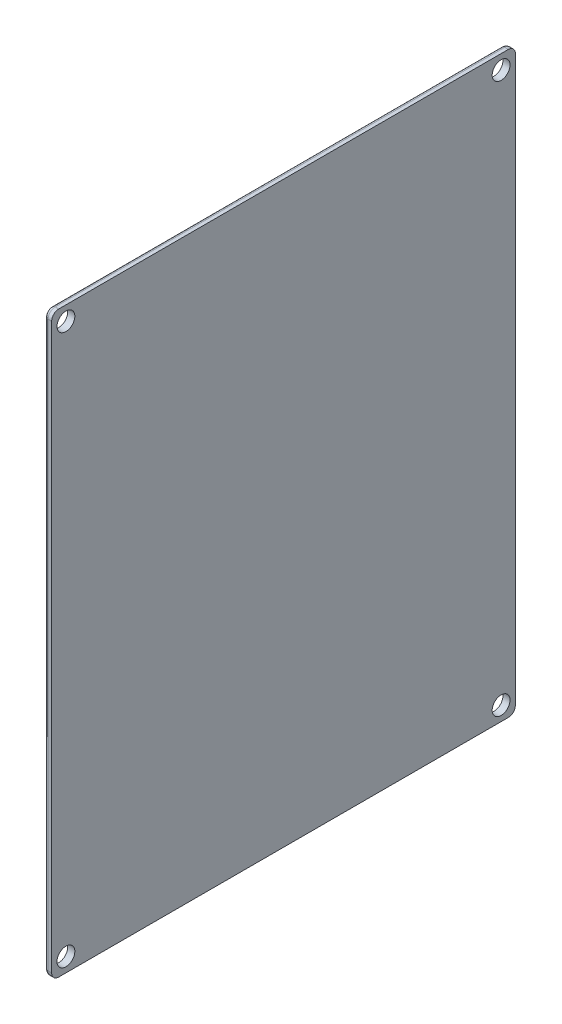
ISO-10303-21;
HEADER;
FILE_DESCRIPTION(('STEP AP214'),'2;1');
FILE_NAME('part.step','',(''),(''),'','','');
FILE_SCHEMA(('AUTOMOTIVE_DESIGN { 1 0 10303 214 1 1 1 1 }'));
ENDSEC;
DATA;
#1=APPLICATION_CONTEXT('core data for automotive mechanical design processes');
#2=APPLICATION_PROTOCOL_DEFINITION('international standard','automotive_design',2000,#1);
#3=PRODUCT_CONTEXT('',#1,'mechanical');
#4=PRODUCT('Part','Part','',(#3));
#5=PRODUCT_RELATED_PRODUCT_CATEGORY('part','',(#4));
#6=PRODUCT_DEFINITION_FORMATION('','',#4);
#7=PRODUCT_DEFINITION_CONTEXT('part definition',#1,'design');
#8=PRODUCT_DEFINITION('design','',#6,#7);
#9=PRODUCT_DEFINITION_SHAPE('','',#8);
#10=(LENGTH_UNIT() NAMED_UNIT(*) SI_UNIT(.MILLI.,.METRE.));
#11=(NAMED_UNIT(*) PLANE_ANGLE_UNIT() SI_UNIT($,.RADIAN.));
#12=(NAMED_UNIT(*) SI_UNIT($,.STERADIAN.) SOLID_ANGLE_UNIT());
#13=UNCERTAINTY_MEASURE_WITH_UNIT(LENGTH_MEASURE(1.E-05),#10,'distance_accuracy_value','');
#14=(GEOMETRIC_REPRESENTATION_CONTEXT(3) GLOBAL_UNCERTAINTY_ASSIGNED_CONTEXT((#13)) GLOBAL_UNIT_ASSIGNED_CONTEXT((#10,
#11,#12)) REPRESENTATION_CONTEXT('',''));
#15=CARTESIAN_POINT('',(0.,0.,0.));
#16=DIRECTION('',(0.,0.,1.));
#17=DIRECTION('',(1.,0.,0.));
#18=AXIS2_PLACEMENT_3D('',#15,#16,#17);
#19=CARTESIAN_POINT('',(-92.,0.,0.));
#20=DIRECTION('',(-1.,0.,0.));
#21=DIRECTION('',(0.,0.,1.));
#22=AXIS2_PLACEMENT_3D('',#19,#20,#21);
#23=PLANE('',#22);
#24=CARTESIAN_POINT('',(-92.,79.1,74.3));
#25=DIRECTION('',(-1.,0.,0.));
#26=DIRECTION('',(0.,0.,1.));
#27=AXIS2_PLACEMENT_3D('',#24,#25,#26);
#28=CIRCLE('',#27,1.24999999999999);
#29=CARTESIAN_POINT('',(-92.,79.1,75.55));
#30=VERTEX_POINT('',#29);
#31=EDGE_CURVE('E1025',#30,#30,#28,.F.);
#32=ORIENTED_EDGE('',*,*,#31,.F.);
#33=EDGE_LOOP('',(#32));
#34=FACE_BOUND('',#33,.T.);
#35=CARTESIAN_POINT('',(-92.,79.1,13.3));
#36=DIRECTION('',(-1.,0.,0.));
#37=DIRECTION('',(0.,0.,1.));
#38=AXIS2_PLACEMENT_3D('',#35,#36,#37);
#39=CIRCLE('',#38,1.24999999999999);
#40=CARTESIAN_POINT('',(-92.,79.1,14.55));
#41=VERTEX_POINT('',#40);
#42=EDGE_CURVE('E1019',#41,#41,#39,.F.);
#43=ORIENTED_EDGE('',*,*,#42,.F.);
#44=EDGE_LOOP('',(#43));
#45=FACE_BOUND('',#44,.T.);
#46=CARTESIAN_POINT('',(-92.,2.,74.3));
#47=DIRECTION('',(-1.,0.,0.));
#48=DIRECTION('',(0.,0.,1.));
#49=AXIS2_PLACEMENT_3D('',#46,#47,#48);
#50=CIRCLE('',#49,1.24999999999999);
#51=CARTESIAN_POINT('',(-92.,2.,75.55));
#52=VERTEX_POINT('',#51);
#53=EDGE_CURVE('E1022',#52,#52,#50,.F.);
#54=ORIENTED_EDGE('',*,*,#53,.F.);
#55=EDGE_LOOP('',(#54));
#56=FACE_BOUND('',#55,.T.);
#57=CARTESIAN_POINT('',(-92.,2.,13.3));
#58=DIRECTION('',(-1.,0.,0.));
#59=DIRECTION('',(0.,0.,1.));
#60=AXIS2_PLACEMENT_3D('',#57,#58,#59);
#61=CIRCLE('',#60,1.24999999999999);
#62=CARTESIAN_POINT('',(-92.,2.,14.55));
#63=VERTEX_POINT('',#62);
#64=EDGE_CURVE('E1028',#63,#63,#61,.F.);
#65=ORIENTED_EDGE('',*,*,#64,.F.);
#66=EDGE_LOOP('',(#65));
#67=FACE_BOUND('',#66,.T.);
#68=DIRECTION('',(0.,0.,-1.));
#69=VECTOR('',#68,1.);
#70=CARTESIAN_POINT('',(-92.,0.,0.));
#71=LINE('',#70,#69);
#72=CARTESIAN_POINT('',(-92.,0.,75.3));
#73=VERTEX_POINT('',#72);
#74=CARTESIAN_POINT('',(-92.,0.,12.3));
#75=VERTEX_POINT('',#74);
#76=EDGE_CURVE('E912',#73,#75,#71,.T.);
#77=ORIENTED_EDGE('',*,*,#76,.T.);
#78=CARTESIAN_POINT('',(-92.,1.,12.3));
#79=DIRECTION('',(-1.,0.,0.));
#80=DIRECTION('',(0.,0.,1.));
#81=AXIS2_PLACEMENT_3D('',#78,#79,#80);
#82=CIRCLE('',#81,1.);
#83=CARTESIAN_POINT('',(-92.,1.,11.3));
#84=VERTEX_POINT('',#83);
#85=EDGE_CURVE('E907',#75,#84,#82,.F.);
#86=ORIENTED_EDGE('',*,*,#85,.T.);
#87=DIRECTION('',(0.,-1.,0.));
#88=VECTOR('',#87,1.);
#89=CARTESIAN_POINT('',(-92.,0.,11.3));
#90=LINE('',#89,#88);
#91=CARTESIAN_POINT('',(-92.,80.1,11.3));
#92=VERTEX_POINT('',#91);
#93=EDGE_CURVE('E909',#92,#84,#90,.T.);
#94=ORIENTED_EDGE('',*,*,#93,.F.);
#95=CARTESIAN_POINT('',(-92.,80.1,12.3));
#96=DIRECTION('',(-1.,0.,0.));
#97=DIRECTION('',(0.,0.,1.));
#98=AXIS2_PLACEMENT_3D('',#95,#96,#97);
#99=CIRCLE('',#98,1.);
#100=CARTESIAN_POINT('',(-92.,81.1,12.3));
#101=VERTEX_POINT('',#100);
#102=EDGE_CURVE('E925',#92,#101,#99,.F.);
#103=ORIENTED_EDGE('',*,*,#102,.T.);
#104=DIRECTION('',(0.,0.,-1.));
#105=VECTOR('',#104,1.);
#106=CARTESIAN_POINT('',(-92.,81.1,0.));
#107=LINE('',#106,#105);
#108=CARTESIAN_POINT('',(-92.,81.1,75.3));
#109=VERTEX_POINT('',#108);
#110=EDGE_CURVE('E1015',#109,#101,#107,.T.);
#111=ORIENTED_EDGE('',*,*,#110,.F.);
#112=CARTESIAN_POINT('',(-92.,80.1,75.3));
#113=DIRECTION('',(-1.,0.,0.));
#114=DIRECTION('',(0.,0.,1.));
#115=AXIS2_PLACEMENT_3D('',#112,#113,#114);
#116=CIRCLE('',#115,1.);
#117=CARTESIAN_POINT('',(-92.,80.1,76.3));
#118=VERTEX_POINT('',#117);
#119=EDGE_CURVE('E1012',#109,#118,#116,.F.);
#120=ORIENTED_EDGE('',*,*,#119,.T.);
#121=DIRECTION('',(0.,1.,0.));
#122=VECTOR('',#121,1.);
#123=CARTESIAN_POINT('',(-92.,0.,76.3));
#124=LINE('',#123,#122);
#125=CARTESIAN_POINT('',(-92.,1.,76.3));
#126=VERTEX_POINT('',#125);
#127=EDGE_CURVE('E1009',#126,#118,#124,.T.);
#128=ORIENTED_EDGE('',*,*,#127,.F.);
#129=CARTESIAN_POINT('',(-92.,1.,75.3));
#130=DIRECTION('',(-1.,0.,0.));
#131=DIRECTION('',(0.,0.,1.));
#132=AXIS2_PLACEMENT_3D('',#129,#130,#131);
#133=CIRCLE('',#132,1.);
#134=EDGE_CURVE('E1011',#126,#73,#133,.F.);
#135=ORIENTED_EDGE('',*,*,#134,.T.);
#136=EDGE_LOOP('',(#77,#86,#94,#103,#111,#120,#128,#135));
#137=FACE_BOUND('',#136,.T.);
#138=ADVANCED_FACE('F815',(#34,#45,#56,#67,#137),#23,.F.);
#139=CARTESIAN_POINT('',(-93.,2.,13.3));
#140=DIRECTION('',(-1.,0.,0.));
#141=DIRECTION('',(0.,0.,1.));
#142=AXIS2_PLACEMENT_3D('',#139,#140,#141);
#143=CYLINDRICAL_SURFACE('',#142,1.24999999999999);
#144=ORIENTED_EDGE('',*,*,#64,.T.);
#145=EDGE_LOOP('',(#144));
#146=FACE_BOUND('',#145,.T.);
#147=CARTESIAN_POINT('',(-93.,2.,13.3));
#148=DIRECTION('',(-1.,0.,0.));
#149=DIRECTION('',(0.,0.,1.));
#150=AXIS2_PLACEMENT_3D('',#147,#148,#149);
#151=CIRCLE('',#150,1.24999999999999);
#152=CARTESIAN_POINT('',(-93.,2.,14.55));
#153=VERTEX_POINT('',#152);
#154=EDGE_CURVE('E1031',#153,#153,#151,.T.);
#155=ORIENTED_EDGE('',*,*,#154,.T.);
#156=EDGE_LOOP('',(#155));
#157=FACE_BOUND('',#156,.T.);
#158=ADVANCED_FACE('F1084',(#146,#157),#143,.F.);
#159=CARTESIAN_POINT('',(-93.,79.1,74.3));
#160=DIRECTION('',(-1.,0.,0.));
#161=DIRECTION('',(0.,0.,1.));
#162=AXIS2_PLACEMENT_3D('',#159,#160,#161);
#163=CYLINDRICAL_SURFACE('',#162,1.24999999999999);
#164=ORIENTED_EDGE('',*,*,#31,.T.);
#165=EDGE_LOOP('',(#164));
#166=FACE_BOUND('',#165,.T.);
#167=CARTESIAN_POINT('',(-93.,79.1,74.3));
#168=DIRECTION('',(-1.,0.,0.));
#169=DIRECTION('',(0.,0.,1.));
#170=AXIS2_PLACEMENT_3D('',#167,#168,#169);
#171=CIRCLE('',#170,1.24999999999999);
#172=CARTESIAN_POINT('',(-93.,79.1,75.55));
#173=VERTEX_POINT('',#172);
#174=EDGE_CURVE('E1034',#173,#173,#171,.T.);
#175=ORIENTED_EDGE('',*,*,#174,.T.);
#176=EDGE_LOOP('',(#175));
#177=FACE_BOUND('',#176,.T.);
#178=ADVANCED_FACE('F1092',(#166,#177),#163,.F.);
#179=CARTESIAN_POINT('',(-93.,2.,74.3));
#180=DIRECTION('',(-1.,0.,0.));
#181=DIRECTION('',(0.,0.,1.));
#182=AXIS2_PLACEMENT_3D('',#179,#180,#181);
#183=CYLINDRICAL_SURFACE('',#182,1.24999999999999);
#184=ORIENTED_EDGE('',*,*,#53,.T.);
#185=EDGE_LOOP('',(#184));
#186=FACE_BOUND('',#185,.T.);
#187=CARTESIAN_POINT('',(-93.,2.,74.3));
#188=DIRECTION('',(-1.,0.,0.));
#189=DIRECTION('',(0.,0.,1.));
#190=AXIS2_PLACEMENT_3D('',#187,#188,#189);
#191=CIRCLE('',#190,1.24999999999999);
#192=CARTESIAN_POINT('',(-93.,2.,75.55));
#193=VERTEX_POINT('',#192);
#194=EDGE_CURVE('E1037',#193,#193,#191,.T.);
#195=ORIENTED_EDGE('',*,*,#194,.T.);
#196=EDGE_LOOP('',(#195));
#197=FACE_BOUND('',#196,.T.);
#198=ADVANCED_FACE('F1113',(#186,#197),#183,.F.);
#199=CARTESIAN_POINT('',(-93.,79.1,13.3));
#200=DIRECTION('',(-1.,0.,0.));
#201=DIRECTION('',(0.,0.,1.));
#202=AXIS2_PLACEMENT_3D('',#199,#200,#201);
#203=CYLINDRICAL_SURFACE('',#202,1.24999999999999);
#204=ORIENTED_EDGE('',*,*,#42,.T.);
#205=EDGE_LOOP('',(#204));
#206=FACE_BOUND('',#205,.T.);
#207=CARTESIAN_POINT('',(-93.,79.1,13.3));
#208=DIRECTION('',(-1.,0.,0.));
#209=DIRECTION('',(0.,0.,1.));
#210=AXIS2_PLACEMENT_3D('',#207,#208,#209);
#211=CIRCLE('',#210,1.24999999999999);
#212=CARTESIAN_POINT('',(-93.,79.1,14.55));
#213=VERTEX_POINT('',#212);
#214=EDGE_CURVE('E1040',#213,#213,#211,.T.);
#215=ORIENTED_EDGE('',*,*,#214,.T.);
#216=EDGE_LOOP('',(#215));
#217=FACE_BOUND('',#216,.T.);
#218=ADVANCED_FACE('F1109',(#206,#217),#203,.F.);
#219=CARTESIAN_POINT('',(-93.,0.,0.));
#220=DIRECTION('',(-1.,0.,0.));
#221=DIRECTION('',(0.,0.,1.));
#222=AXIS2_PLACEMENT_3D('',#219,#220,#221);
#223=PLANE('',#222);
#224=DIRECTION('',(0.,-1.,0.));
#225=VECTOR('',#224,1.);
#226=CARTESIAN_POINT('',(-93.,1.,11.8));
#227=LINE('',#226,#225);
#228=CARTESIAN_POINT('',(-93.,80.1,11.8));
#229=VERTEX_POINT('',#228);
#230=CARTESIAN_POINT('',(-93.,1.,11.8));
#231=VERTEX_POINT('',#230);
#232=EDGE_CURVE('E955',#229,#231,#227,.T.);
#233=ORIENTED_EDGE('',*,*,#232,.T.);
#234=CARTESIAN_POINT('',(-93.,1.,12.3));
#235=DIRECTION('',(-1.,0.,0.));
#236=DIRECTION('',(0.,0.,1.));
#237=AXIS2_PLACEMENT_3D('',#234,#235,#236);
#238=CIRCLE('',#237,0.5);
#239=CARTESIAN_POINT('',(-93.,0.5,12.3));
#240=VERTEX_POINT('',#239);
#241=EDGE_CURVE('E957',#231,#240,#238,.T.);
#242=ORIENTED_EDGE('',*,*,#241,.T.);
#243=DIRECTION('',(0.,0.,1.));
#244=VECTOR('',#243,1.);
#245=CARTESIAN_POINT('',(-93.,0.5,0.));
#246=LINE('',#245,#244);
#247=CARTESIAN_POINT('',(-93.,0.5,75.3));
#248=VERTEX_POINT('',#247);
#249=EDGE_CURVE('E916',#240,#248,#246,.T.);
#250=ORIENTED_EDGE('',*,*,#249,.T.);
#251=CARTESIAN_POINT('',(-93.,1.,75.3));
#252=DIRECTION('',(-1.,0.,0.));
#253=DIRECTION('',(0.,0.,1.));
#254=AXIS2_PLACEMENT_3D('',#251,#252,#253);
#255=CIRCLE('',#254,0.5);
#256=CARTESIAN_POINT('',(-93.,1.,75.8));
#257=VERTEX_POINT('',#256);
#258=EDGE_CURVE('E945',#248,#257,#255,.T.);
#259=ORIENTED_EDGE('',*,*,#258,.T.);
#260=DIRECTION('',(0.,1.,0.));
#261=VECTOR('',#260,1.);
#262=CARTESIAN_POINT('',(-93.,80.1,75.8));
#263=LINE('',#262,#261);
#264=CARTESIAN_POINT('',(-93.,80.1,75.8));
#265=VERTEX_POINT('',#264);
#266=EDGE_CURVE('E947',#257,#265,#263,.T.);
#267=ORIENTED_EDGE('',*,*,#266,.T.);
#268=CARTESIAN_POINT('',(-93.,80.1,75.3));
#269=DIRECTION('',(-1.,0.,0.));
#270=DIRECTION('',(0.,0.,1.));
#271=AXIS2_PLACEMENT_3D('',#268,#269,#270);
#272=CIRCLE('',#271,0.5);
#273=CARTESIAN_POINT('',(-93.,80.6,75.3));
#274=VERTEX_POINT('',#273);
#275=EDGE_CURVE('E949',#265,#274,#272,.T.);
#276=ORIENTED_EDGE('',*,*,#275,.T.);
#277=DIRECTION('',(0.,0.,-1.));
#278=VECTOR('',#277,1.);
#279=CARTESIAN_POINT('',(-93.,80.6,12.3));
#280=LINE('',#279,#278);
#281=CARTESIAN_POINT('',(-93.,80.6,12.3));
#282=VERTEX_POINT('',#281);
#283=EDGE_CURVE('E951',#274,#282,#280,.T.);
#284=ORIENTED_EDGE('',*,*,#283,.T.);
#285=CARTESIAN_POINT('',(-93.,80.1,12.3));
#286=DIRECTION('',(-1.,0.,0.));
#287=DIRECTION('',(0.,0.,1.));
#288=AXIS2_PLACEMENT_3D('',#285,#286,#287);
#289=CIRCLE('',#288,0.5);
#290=EDGE_CURVE('E953',#282,#229,#289,.T.);
#291=ORIENTED_EDGE('',*,*,#290,.T.);
#292=EDGE_LOOP('',(#233,#242,#250,#259,#267,#276,#284,#291));
#293=FACE_BOUND('',#292,.T.);
#294=ORIENTED_EDGE('',*,*,#214,.F.);
#295=EDGE_LOOP('',(#294));
#296=FACE_BOUND('',#295,.T.);
#297=ORIENTED_EDGE('',*,*,#194,.F.);
#298=EDGE_LOOP('',(#297));
#299=FACE_BOUND('',#298,.T.);
#300=ORIENTED_EDGE('',*,*,#174,.F.);
#301=EDGE_LOOP('',(#300));
#302=FACE_BOUND('',#301,.T.);
#303=ORIENTED_EDGE('',*,*,#154,.F.);
#304=EDGE_LOOP('',(#303));
#305=FACE_BOUND('',#304,.T.);
#306=ADVANCED_FACE('F1059',(#293,#296,#299,#302,#305),#223,.T.);
#307=CARTESIAN_POINT('',(0.,1.,12.3));
#308=DIRECTION('',(-1.,0.,0.));
#309=DIRECTION('',(0.,0.,1.));
#310=AXIS2_PLACEMENT_3D('',#307,#308,#309);
#311=CYLINDRICAL_SURFACE('',#310,1.);
#312=DIRECTION('',(1.,0.,0.));
#313=VECTOR('',#312,1.);
#314=CARTESIAN_POINT('',(-77.,0.,12.3));
#315=LINE('',#314,#313);
#316=CARTESIAN_POINT('',(-92.5,0.,12.3));
#317=VERTEX_POINT('',#316);
#318=EDGE_CURVE('E936',#317,#75,#315,.T.);
#319=ORIENTED_EDGE('',*,*,#318,.F.);
#320=CARTESIAN_POINT('',(-92.5,1.,12.3));
#321=DIRECTION('',(-1.,0.,0.));
#322=DIRECTION('',(0.,0.,1.));
#323=AXIS2_PLACEMENT_3D('',#320,#321,#322);
#324=CIRCLE('',#323,1.);
#325=CARTESIAN_POINT('',(-92.5,1.,11.3));
#326=VERTEX_POINT('',#325);
#327=EDGE_CURVE('E930',#317,#326,#324,.F.);
#328=ORIENTED_EDGE('',*,*,#327,.T.);
#329=DIRECTION('',(1.,0.,0.));
#330=VECTOR('',#329,1.);
#331=CARTESIAN_POINT('',(-93.,1.,11.3));
#332=LINE('',#331,#330);
#333=EDGE_CURVE('E922',#84,#326,#332,.F.);
#334=ORIENTED_EDGE('',*,*,#333,.F.);
#335=ORIENTED_EDGE('',*,*,#85,.F.);
#336=EDGE_LOOP('',(#319,#328,#334,#335));
#337=FACE_BOUND('',#336,.T.);
#338=ADVANCED_FACE('F928',(#337),#311,.T.);
#339=CARTESIAN_POINT('',(-93.,80.1,12.3));
#340=DIRECTION('',(1.,0.,0.));
#341=DIRECTION('',(0.,0.,-1.));
#342=AXIS2_PLACEMENT_3D('',#339,#340,#341);
#343=CYLINDRICAL_SURFACE('',#342,1.);
#344=DIRECTION('',(1.,0.,0.));
#345=VECTOR('',#344,1.);
#346=CARTESIAN_POINT('',(-93.,80.1,11.3));
#347=LINE('',#346,#345);
#348=CARTESIAN_POINT('',(-92.5,80.1,11.3));
#349=VERTEX_POINT('',#348);
#350=EDGE_CURVE('E924',#349,#92,#347,.T.);
#351=ORIENTED_EDGE('',*,*,#350,.F.);
#352=CARTESIAN_POINT('',(-92.5,80.1,12.3));
#353=DIRECTION('',(-1.,0.,0.));
#354=DIRECTION('',(0.,0.,1.));
#355=AXIS2_PLACEMENT_3D('',#352,#353,#354);
#356=CIRCLE('',#355,1.);
#357=CARTESIAN_POINT('',(-92.5,81.1,12.3));
#358=VERTEX_POINT('',#357);
#359=EDGE_CURVE('E963',#349,#358,#356,.F.);
#360=ORIENTED_EDGE('',*,*,#359,.T.);
#361=DIRECTION('',(1.,0.,0.));
#362=VECTOR('',#361,1.);
#363=CARTESIAN_POINT('',(0.,81.1,12.3));
#364=LINE('',#363,#362);
#365=EDGE_CURVE('E931',#101,#358,#364,.F.);
#366=ORIENTED_EDGE('',*,*,#365,.F.);
#367=ORIENTED_EDGE('',*,*,#102,.F.);
#368=EDGE_LOOP('',(#351,#360,#366,#367));
#369=FACE_BOUND('',#368,.T.);
#370=ADVANCED_FACE('F1068',(#369),#343,.T.);
#371=CARTESIAN_POINT('',(-93.,0.,11.3));
#372=DIRECTION('',(0.,0.,1.));
#373=DIRECTION('',(0.,-1.,0.));
#374=AXIS2_PLACEMENT_3D('',#371,#372,#373);
#375=PLANE('',#374);
#376=ORIENTED_EDGE('',*,*,#333,.T.);
#377=DIRECTION('',(0.,-1.,0.));
#378=VECTOR('',#377,1.);
#379=CARTESIAN_POINT('',(-92.5,80.1,11.3));
#380=LINE('',#379,#378);
#381=EDGE_CURVE('E961',#326,#349,#380,.F.);
#382=ORIENTED_EDGE('',*,*,#381,.T.);
#383=ORIENTED_EDGE('',*,*,#350,.T.);
#384=ORIENTED_EDGE('',*,*,#93,.T.);
#385=EDGE_LOOP('',(#376,#382,#383,#384));
#386=FACE_BOUND('',#385,.T.);
#387=ADVANCED_FACE('F921',(#386),#375,.F.);
#388=CARTESIAN_POINT('',(0.,80.1,75.3));
#389=DIRECTION('',(1.,0.,0.));
#390=DIRECTION('',(0.,0.,-1.));
#391=AXIS2_PLACEMENT_3D('',#388,#389,#390);
#392=CYLINDRICAL_SURFACE('',#391,1.);
#393=DIRECTION('',(1.,0.,0.));
#394=VECTOR('',#393,1.);
#395=CARTESIAN_POINT('',(0.,81.1,75.3));
#396=LINE('',#395,#394);
#397=CARTESIAN_POINT('',(-92.5,81.1,75.3));
#398=VERTEX_POINT('',#397);
#399=EDGE_CURVE('E934',#398,#109,#396,.T.);
#400=ORIENTED_EDGE('',*,*,#399,.F.);
#401=CARTESIAN_POINT('',(-92.5,80.1,75.3));
#402=DIRECTION('',(-1.,0.,0.));
#403=DIRECTION('',(0.,0.,1.));
#404=AXIS2_PLACEMENT_3D('',#401,#402,#403);
#405=CIRCLE('',#404,1.);
#406=CARTESIAN_POINT('',(-92.5,80.1,76.3));
#407=VERTEX_POINT('',#406);
#408=EDGE_CURVE('E967',#398,#407,#405,.F.);
#409=ORIENTED_EDGE('',*,*,#408,.T.);
#410=DIRECTION('',(1.,0.,0.));
#411=VECTOR('',#410,1.);
#412=CARTESIAN_POINT('',(-93.,80.1,76.3));
#413=LINE('',#412,#411);
#414=EDGE_CURVE('E941',#118,#407,#413,.F.);
#415=ORIENTED_EDGE('',*,*,#414,.F.);
#416=ORIENTED_EDGE('',*,*,#119,.F.);
#417=EDGE_LOOP('',(#400,#409,#415,#416));
#418=FACE_BOUND('',#417,.T.);
#419=ADVANCED_FACE('F1004',(#418),#392,.T.);
#420=CARTESIAN_POINT('',(-93.,1.,75.3));
#421=DIRECTION('',(-1.,0.,0.));
#422=DIRECTION('',(0.,0.,1.));
#423=AXIS2_PLACEMENT_3D('',#420,#421,#422);
#424=CYLINDRICAL_SURFACE('',#423,1.);
#425=DIRECTION('',(1.,0.,0.));
#426=VECTOR('',#425,1.);
#427=CARTESIAN_POINT('',(-77.,1.,76.3));
#428=LINE('',#427,#426);
#429=CARTESIAN_POINT('',(-92.5,1.,76.3));
#430=VERTEX_POINT('',#429);
#431=EDGE_CURVE('E917',#430,#126,#428,.T.);
#432=ORIENTED_EDGE('',*,*,#431,.F.);
#433=CARTESIAN_POINT('',(-92.5,1.,75.3));
#434=DIRECTION('',(-1.,0.,0.));
#435=DIRECTION('',(0.,0.,1.));
#436=AXIS2_PLACEMENT_3D('',#433,#434,#435);
#437=CIRCLE('',#436,1.);
#438=CARTESIAN_POINT('',(-92.5,0.,75.3));
#439=VERTEX_POINT('',#438);
#440=EDGE_CURVE('E824',#430,#439,#437,.F.);
#441=ORIENTED_EDGE('',*,*,#440,.T.);
#442=DIRECTION('',(1.,0.,0.));
#443=VECTOR('',#442,1.);
#444=CARTESIAN_POINT('',(-93.,0.,75.3));
#445=LINE('',#444,#443);
#446=EDGE_CURVE('E1043',#73,#439,#445,.F.);
#447=ORIENTED_EDGE('',*,*,#446,.F.);
#448=ORIENTED_EDGE('',*,*,#134,.F.);
#449=EDGE_LOOP('',(#432,#441,#447,#448));
#450=FACE_BOUND('',#449,.T.);
#451=ADVANCED_FACE('F1106',(#450),#424,.T.);
#452=CARTESIAN_POINT('',(-93.,0.,76.3));
#453=DIRECTION('',(0.,0.,-1.));
#454=DIRECTION('',(-1.,0.,0.));
#455=AXIS2_PLACEMENT_3D('',#452,#453,#454);
#456=PLANE('',#455);
#457=ORIENTED_EDGE('',*,*,#414,.T.);
#458=DIRECTION('',(0.,1.,0.));
#459=VECTOR('',#458,1.);
#460=CARTESIAN_POINT('',(-92.5,1.,76.3));
#461=LINE('',#460,#459);
#462=EDGE_CURVE('E839',#407,#430,#461,.F.);
#463=ORIENTED_EDGE('',*,*,#462,.T.);
#464=ORIENTED_EDGE('',*,*,#431,.T.);
#465=ORIENTED_EDGE('',*,*,#127,.T.);
#466=EDGE_LOOP('',(#457,#463,#464,#465));
#467=FACE_BOUND('',#466,.T.);
#468=ADVANCED_FACE('F1007',(#467),#456,.F.);
#469=CARTESIAN_POINT('',(0.,0.,0.));
#470=DIRECTION('',(0.,-1.,0.));
#471=DIRECTION('',(0.,0.,-1.));
#472=AXIS2_PLACEMENT_3D('',#469,#470,#471);
#473=PLANE('',#472);
#474=ORIENTED_EDGE('',*,*,#446,.T.);
#475=DIRECTION('',(0.,0.,1.));
#476=VECTOR('',#475,1.);
#477=CARTESIAN_POINT('',(-92.5,0.,0.));
#478=LINE('',#477,#476);
#479=EDGE_CURVE('E12',#439,#317,#478,.F.);
#480=ORIENTED_EDGE('',*,*,#479,.T.);
#481=ORIENTED_EDGE('',*,*,#318,.T.);
#482=ORIENTED_EDGE('',*,*,#76,.F.);
#483=EDGE_LOOP('',(#474,#480,#481,#482));
#484=FACE_BOUND('',#483,.T.);
#485=ADVANCED_FACE('F1045',(#484),#473,.T.);
#486=CARTESIAN_POINT('',(0.,81.1,0.));
#487=DIRECTION('',(0.,-1.,0.));
#488=DIRECTION('',(0.,0.,-1.));
#489=AXIS2_PLACEMENT_3D('',#486,#487,#488);
#490=PLANE('',#489);
#491=ORIENTED_EDGE('',*,*,#365,.T.);
#492=DIRECTION('',(0.,0.,-1.));
#493=VECTOR('',#492,1.);
#494=CARTESIAN_POINT('',(-92.5,81.1,75.3));
#495=LINE('',#494,#493);
#496=EDGE_CURVE('E965',#358,#398,#495,.F.);
#497=ORIENTED_EDGE('',*,*,#496,.T.);
#498=ORIENTED_EDGE('',*,*,#399,.T.);
#499=ORIENTED_EDGE('',*,*,#110,.T.);
#500=EDGE_LOOP('',(#491,#497,#498,#499));
#501=FACE_BOUND('',#500,.T.);
#502=ADVANCED_FACE('F1100',(#501),#490,.F.);
#503=CARTESIAN_POINT('',(-92.5,80.1,75.3));
#504=DIRECTION('',(-1.,0.,0.));
#505=DIRECTION('',(0.,0.,1.));
#506=AXIS2_PLACEMENT_3D('',#503,#504,#505);
#507=DEGENERATE_TOROIDAL_SURFACE('',#506,0.5,0.5,.T.);
#508=CARTESIAN_POINT('',(-92.5,80.1,75.8));
#509=DIRECTION('',(0.,-1.,0.));
#510=DIRECTION('',(0.,0.,-1.));
#511=AXIS2_PLACEMENT_3D('',#508,#509,#510);
#512=CIRCLE('',#511,0.5);
#513=EDGE_CURVE('E986',#407,#265,#512,.T.);
#514=ORIENTED_EDGE('',*,*,#513,.F.);
#515=ORIENTED_EDGE('',*,*,#408,.F.);
#516=CARTESIAN_POINT('',(-92.5,80.6,75.3));
#517=DIRECTION('',(0.,0.,-1.));
#518=DIRECTION('',(-1.,0.,0.));
#519=AXIS2_PLACEMENT_3D('',#516,#517,#518);
#520=CIRCLE('',#519,0.5);
#521=EDGE_CURVE('E819',#274,#398,#520,.T.);
#522=ORIENTED_EDGE('',*,*,#521,.F.);
#523=ORIENTED_EDGE('',*,*,#275,.F.);
#524=EDGE_LOOP('',(#514,#515,#522,#523));
#525=FACE_BOUND('',#524,.T.);
#526=ADVANCED_FACE('F817',(#525),#507,.T.);
#527=CARTESIAN_POINT('',(-92.5,80.6,0.));
#528=DIRECTION('',(0.,0.,1.));
#529=DIRECTION('',(1.,0.,0.));
#530=AXIS2_PLACEMENT_3D('',#527,#528,#529);
#531=CYLINDRICAL_SURFACE('',#530,0.5);
#532=ORIENTED_EDGE('',*,*,#521,.T.);
#533=ORIENTED_EDGE('',*,*,#496,.F.);
#534=CARTESIAN_POINT('',(-92.5,80.6,12.3));
#535=DIRECTION('',(0.,0.,-1.));
#536=DIRECTION('',(-1.,0.,0.));
#537=AXIS2_PLACEMENT_3D('',#534,#535,#536);
#538=CIRCLE('',#537,0.5);
#539=EDGE_CURVE('E984',#282,#358,#538,.T.);
#540=ORIENTED_EDGE('',*,*,#539,.F.);
#541=ORIENTED_EDGE('',*,*,#283,.F.);
#542=EDGE_LOOP('',(#532,#533,#540,#541));
#543=FACE_BOUND('',#542,.T.);
#544=ADVANCED_FACE('F996',(#543),#531,.T.);
#545=CARTESIAN_POINT('',(-92.5,0.,75.8));
#546=DIRECTION('',(0.,-1.,0.));
#547=DIRECTION('',(0.,0.,-1.));
#548=AXIS2_PLACEMENT_3D('',#545,#546,#547);
#549=CYLINDRICAL_SURFACE('',#548,0.5);
#550=ORIENTED_EDGE('',*,*,#513,.T.);
#551=ORIENTED_EDGE('',*,*,#266,.F.);
#552=CARTESIAN_POINT('',(-92.5,1.,75.8));
#553=DIRECTION('',(0.,-1.,0.));
#554=DIRECTION('',(0.,0.,-1.));
#555=AXIS2_PLACEMENT_3D('',#552,#553,#554);
#556=CIRCLE('',#555,0.5);
#557=EDGE_CURVE('E981',#430,#257,#556,.T.);
#558=ORIENTED_EDGE('',*,*,#557,.F.);
#559=ORIENTED_EDGE('',*,*,#462,.F.);
#560=EDGE_LOOP('',(#550,#551,#558,#559));
#561=FACE_BOUND('',#560,.T.);
#562=ADVANCED_FACE('F1074',(#561),#549,.T.);
#563=CARTESIAN_POINT('',(-92.5,80.1,12.3));
#564=DIRECTION('',(-1.,0.,0.));
#565=DIRECTION('',(0.,0.,1.));
#566=AXIS2_PLACEMENT_3D('',#563,#564,#565);
#567=DEGENERATE_TOROIDAL_SURFACE('',#566,0.5,0.5,.T.);
#568=ORIENTED_EDGE('',*,*,#539,.T.);
#569=ORIENTED_EDGE('',*,*,#359,.F.);
#570=CARTESIAN_POINT('',(-92.5,80.1,11.8));
#571=DIRECTION('',(0.,-1.,0.));
#572=DIRECTION('',(0.,0.,-1.));
#573=AXIS2_PLACEMENT_3D('',#570,#571,#572);
#574=CIRCLE('',#573,0.5);
#575=EDGE_CURVE('E978',#229,#349,#574,.T.);
#576=ORIENTED_EDGE('',*,*,#575,.F.);
#577=ORIENTED_EDGE('',*,*,#290,.F.);
#578=EDGE_LOOP('',(#568,#569,#576,#577));
#579=FACE_BOUND('',#578,.T.);
#580=ADVANCED_FACE('F1071',(#579),#567,.T.);
#581=CARTESIAN_POINT('',(-92.5,1.,75.3));
#582=DIRECTION('',(-1.,0.,0.));
#583=DIRECTION('',(0.,0.,1.));
#584=AXIS2_PLACEMENT_3D('',#581,#582,#583);
#585=DEGENERATE_TOROIDAL_SURFACE('',#584,0.5,0.5,.T.);
#586=ORIENTED_EDGE('',*,*,#557,.T.);
#587=ORIENTED_EDGE('',*,*,#258,.F.);
#588=CARTESIAN_POINT('',(-92.5,0.5,75.3));
#589=DIRECTION('',(0.,0.,-1.));
#590=DIRECTION('',(-1.,0.,0.));
#591=AXIS2_PLACEMENT_3D('',#588,#589,#590);
#592=CIRCLE('',#591,0.5);
#593=EDGE_CURVE('E975',#439,#248,#592,.T.);
#594=ORIENTED_EDGE('',*,*,#593,.F.);
#595=ORIENTED_EDGE('',*,*,#440,.F.);
#596=EDGE_LOOP('',(#586,#587,#594,#595));
#597=FACE_BOUND('',#596,.T.);
#598=ADVANCED_FACE('F1073',(#597),#585,.T.);
#599=CARTESIAN_POINT('',(-92.5,0.,11.8));
#600=DIRECTION('',(0.,1.,0.));
#601=DIRECTION('',(0.,0.,1.));
#602=AXIS2_PLACEMENT_3D('',#599,#600,#601);
#603=CYLINDRICAL_SURFACE('',#602,0.5);
#604=ORIENTED_EDGE('',*,*,#575,.T.);
#605=ORIENTED_EDGE('',*,*,#381,.F.);
#606=CARTESIAN_POINT('',(-92.5,1.,11.8));
#607=DIRECTION('',(0.,-1.,0.));
#608=DIRECTION('',(0.,0.,-1.));
#609=AXIS2_PLACEMENT_3D('',#606,#607,#608);
#610=CIRCLE('',#609,0.5);
#611=EDGE_CURVE('E973',#231,#326,#610,.T.);
#612=ORIENTED_EDGE('',*,*,#611,.F.);
#613=ORIENTED_EDGE('',*,*,#232,.F.);
#614=EDGE_LOOP('',(#604,#605,#612,#613));
#615=FACE_BOUND('',#614,.T.);
#616=ADVANCED_FACE('F1065',(#615),#603,.T.);
#617=CARTESIAN_POINT('',(-92.5,0.5,0.));
#618=DIRECTION('',(0.,0.,1.));
#619=DIRECTION('',(1.,0.,0.));
#620=AXIS2_PLACEMENT_3D('',#617,#618,#619);
#621=CYLINDRICAL_SURFACE('',#620,0.5);
#622=ORIENTED_EDGE('',*,*,#593,.T.);
#623=ORIENTED_EDGE('',*,*,#249,.F.);
#624=CARTESIAN_POINT('',(-92.5,0.5,12.3));
#625=DIRECTION('',(0.,0.,-1.));
#626=DIRECTION('',(-1.,0.,0.));
#627=AXIS2_PLACEMENT_3D('',#624,#625,#626);
#628=CIRCLE('',#627,0.5);
#629=EDGE_CURVE('E971',#317,#240,#628,.T.);
#630=ORIENTED_EDGE('',*,*,#629,.F.);
#631=ORIENTED_EDGE('',*,*,#479,.F.);
#632=EDGE_LOOP('',(#622,#623,#630,#631));
#633=FACE_BOUND('',#632,.T.);
#634=ADVANCED_FACE('F1055',(#633),#621,.T.);
#635=CARTESIAN_POINT('',(-92.5,1.,12.3));
#636=DIRECTION('',(-1.,0.,0.));
#637=DIRECTION('',(0.,0.,1.));
#638=AXIS2_PLACEMENT_3D('',#635,#636,#637);
#639=DEGENERATE_TOROIDAL_SURFACE('',#638,0.5,0.5,.T.);
#640=ORIENTED_EDGE('',*,*,#611,.T.);
#641=ORIENTED_EDGE('',*,*,#327,.F.);
#642=ORIENTED_EDGE('',*,*,#629,.T.);
#643=ORIENTED_EDGE('',*,*,#241,.F.);
#644=EDGE_LOOP('',(#640,#641,#642,#643));
#645=FACE_BOUND('',#644,.T.);
#646=ADVANCED_FACE('F1049',(#645),#639,.T.);
#647=CLOSED_SHELL('',(#138,#158,#178,#198,#218,#306,#338,#370,#387,#419,#451,#468,#485,#502,
#526,#544,#562,#580,#598,#616,#634,#646));
#648=MANIFOLD_SOLID_BREP('B2',#647);
#649=ADVANCED_BREP_SHAPE_REPRESENTATION('',(#18,#648),#14);
#650=SHAPE_DEFINITION_REPRESENTATION(#9,#649);
ENDSEC;
END-ISO-10303-21;
